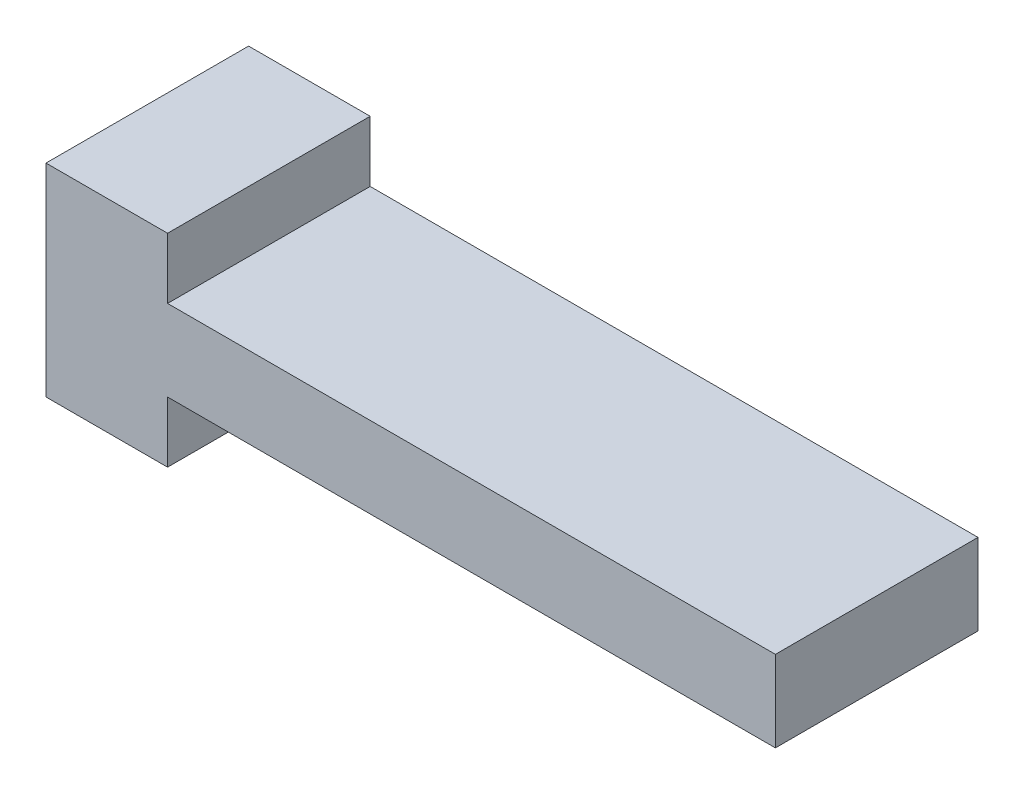
ISO-10303-21;
HEADER;
FILE_DESCRIPTION(('STEP AP214'),'2;1');
FILE_NAME('part.step','',(''),(''),'','','');
FILE_SCHEMA(('AUTOMOTIVE_DESIGN { 1 0 10303 214 1 1 1 1 }'));
ENDSEC;
DATA;
#1=APPLICATION_CONTEXT('core data for automotive mechanical design processes');
#2=APPLICATION_PROTOCOL_DEFINITION('international standard','automotive_design',2000,#1);
#3=PRODUCT_CONTEXT('',#1,'mechanical');
#4=PRODUCT('Part','Part','',(#3));
#5=PRODUCT_RELATED_PRODUCT_CATEGORY('part','',(#4));
#6=PRODUCT_DEFINITION_FORMATION('','',#4);
#7=PRODUCT_DEFINITION_CONTEXT('part definition',#1,'design');
#8=PRODUCT_DEFINITION('design','',#6,#7);
#9=PRODUCT_DEFINITION_SHAPE('','',#8);
#10=(LENGTH_UNIT() NAMED_UNIT(*) SI_UNIT(.MILLI.,.METRE.));
#11=(NAMED_UNIT(*) PLANE_ANGLE_UNIT() SI_UNIT($,.RADIAN.));
#12=(NAMED_UNIT(*) SI_UNIT($,.STERADIAN.) SOLID_ANGLE_UNIT());
#13=UNCERTAINTY_MEASURE_WITH_UNIT(LENGTH_MEASURE(1.E-05),#10,'distance_accuracy_value','');
#14=(GEOMETRIC_REPRESENTATION_CONTEXT(3) GLOBAL_UNCERTAINTY_ASSIGNED_CONTEXT((#13)) GLOBAL_UNIT_ASSIGNED_CONTEXT((#10,
#11,#12)) REPRESENTATION_CONTEXT('',''));
#15=CARTESIAN_POINT('',(0.,0.,0.));
#16=DIRECTION('',(0.,0.,1.));
#17=DIRECTION('',(1.,0.,0.));
#18=AXIS2_PLACEMENT_3D('',#15,#16,#17);
#19=CARTESIAN_POINT('',(30.,25.,50.));
#20=DIRECTION('',(0.,-1.,0.));
#21=DIRECTION('',(1.,0.,0.));
#22=AXIS2_PLACEMENT_3D('',#19,#20,#21);
#23=PLANE('',#22);
#24=DIRECTION('',(-1.,0.,0.));
#25=VECTOR('',#24,1.);
#26=CARTESIAN_POINT('',(30.,25.,0.));
#27=LINE('',#26,#25);
#28=CARTESIAN_POINT('',(30.,25.,0.));
#29=VERTEX_POINT('',#28);
#30=CARTESIAN_POINT('',(0.,25.,0.));
#31=VERTEX_POINT('',#30);
#32=EDGE_CURVE('E135',#29,#31,#27,.T.);
#33=ORIENTED_EDGE('',*,*,#32,.T.);
#34=DIRECTION('',(0.,0.,-1.));
#35=VECTOR('',#34,1.);
#36=CARTESIAN_POINT('',(0.,25.,50.));
#37=LINE('',#36,#35);
#38=CARTESIAN_POINT('',(0.,25.,50.));
#39=VERTEX_POINT('',#38);
#40=EDGE_CURVE('E11',#39,#31,#37,.T.);
#41=ORIENTED_EDGE('',*,*,#40,.F.);
#42=DIRECTION('',(-1.,0.,0.));
#43=VECTOR('',#42,1.);
#44=CARTESIAN_POINT('',(30.,25.,50.));
#45=LINE('',#44,#43);
#46=CARTESIAN_POINT('',(30.,25.,50.));
#47=VERTEX_POINT('',#46);
#48=EDGE_CURVE('E149',#47,#39,#45,.T.);
#49=ORIENTED_EDGE('',*,*,#48,.F.);
#50=DIRECTION('',(0.,0.,-1.));
#51=VECTOR('',#50,1.);
#52=CARTESIAN_POINT('',(30.,25.,50.));
#53=LINE('',#52,#51);
#54=EDGE_CURVE('E131',#47,#29,#53,.T.);
#55=ORIENTED_EDGE('',*,*,#54,.T.);
#56=EDGE_LOOP('',(#33,#41,#49,#55));
#57=FACE_BOUND('',#56,.T.);
#58=ADVANCED_FACE('F39',(#57),#23,.F.);
#59=CARTESIAN_POINT('',(0.,25.,50.));
#60=DIRECTION('',(1.,0.,0.));
#61=DIRECTION('',(0.,1.,0.));
#62=AXIS2_PLACEMENT_3D('',#59,#60,#61);
#63=PLANE('',#62);
#64=DIRECTION('',(0.,-1.,0.));
#65=VECTOR('',#64,1.);
#66=CARTESIAN_POINT('',(0.,25.,0.));
#67=LINE('',#66,#65);
#68=CARTESIAN_POINT('',(0.,-25.,0.));
#69=VERTEX_POINT('',#68);
#70=EDGE_CURVE('E138',#31,#69,#67,.T.);
#71=ORIENTED_EDGE('',*,*,#70,.T.);
#72=DIRECTION('',(0.,0.,-1.));
#73=VECTOR('',#72,1.);
#74=CARTESIAN_POINT('',(0.,-25.,50.));
#75=LINE('',#74,#73);
#76=CARTESIAN_POINT('',(0.,-25.,50.));
#77=VERTEX_POINT('',#76);
#78=EDGE_CURVE('E47',#77,#69,#75,.T.);
#79=ORIENTED_EDGE('',*,*,#78,.F.);
#80=DIRECTION('',(0.,-1.,0.));
#81=VECTOR('',#80,1.);
#82=CARTESIAN_POINT('',(0.,25.,50.));
#83=LINE('',#82,#81);
#84=EDGE_CURVE('E98',#39,#77,#83,.T.);
#85=ORIENTED_EDGE('',*,*,#84,.F.);
#86=ORIENTED_EDGE('',*,*,#40,.T.);
#87=EDGE_LOOP('',(#71,#79,#85,#86));
#88=FACE_BOUND('',#87,.T.);
#89=ADVANCED_FACE('F184',(#88),#63,.F.);
#90=CARTESIAN_POINT('',(0.,-25.,50.));
#91=DIRECTION('',(0.,1.,0.));
#92=DIRECTION('',(-1.,0.,0.));
#93=AXIS2_PLACEMENT_3D('',#90,#91,#92);
#94=PLANE('',#93);
#95=DIRECTION('',(1.,0.,0.));
#96=VECTOR('',#95,1.);
#97=CARTESIAN_POINT('',(0.,-25.,0.));
#98=LINE('',#97,#96);
#99=CARTESIAN_POINT('',(30.,-25.,0.));
#100=VERTEX_POINT('',#99);
#101=EDGE_CURVE('E140',#69,#100,#98,.T.);
#102=ORIENTED_EDGE('',*,*,#101,.T.);
#103=DIRECTION('',(0.,0.,-1.));
#104=VECTOR('',#103,1.);
#105=CARTESIAN_POINT('',(30.,-25.,50.));
#106=LINE('',#105,#104);
#107=CARTESIAN_POINT('',(30.,-25.,50.));
#108=VERTEX_POINT('',#107);
#109=EDGE_CURVE('E156',#108,#100,#106,.T.);
#110=ORIENTED_EDGE('',*,*,#109,.F.);
#111=DIRECTION('',(1.,0.,0.));
#112=VECTOR('',#111,1.);
#113=CARTESIAN_POINT('',(0.,-25.,50.));
#114=LINE('',#113,#112);
#115=EDGE_CURVE('E164',#77,#108,#114,.T.);
#116=ORIENTED_EDGE('',*,*,#115,.F.);
#117=ORIENTED_EDGE('',*,*,#78,.T.);
#118=EDGE_LOOP('',(#102,#110,#116,#117));
#119=FACE_BOUND('',#118,.T.);
#120=ADVANCED_FACE('F162',(#119),#94,.F.);
#121=CARTESIAN_POINT('',(30.,-25.,50.));
#122=DIRECTION('',(-1.,0.,0.));
#123=DIRECTION('',(0.,-1.,0.));
#124=AXIS2_PLACEMENT_3D('',#121,#122,#123);
#125=PLANE('',#124);
#126=DIRECTION('',(0.,1.,0.));
#127=VECTOR('',#126,1.);
#128=CARTESIAN_POINT('',(30.,-25.,0.));
#129=LINE('',#128,#127);
#130=CARTESIAN_POINT('',(30.,-9.99999999999998,0.));
#131=VERTEX_POINT('',#130);
#132=EDGE_CURVE('E142',#100,#131,#129,.T.);
#133=ORIENTED_EDGE('',*,*,#132,.T.);
#134=DIRECTION('',(0.,0.,-1.));
#135=VECTOR('',#134,1.);
#136=CARTESIAN_POINT('',(30.,-9.99999999999998,50.));
#137=LINE('',#136,#135);
#138=CARTESIAN_POINT('',(30.,-9.99999999999998,50.));
#139=VERTEX_POINT('',#138);
#140=EDGE_CURVE('E153',#139,#131,#137,.T.);
#141=ORIENTED_EDGE('',*,*,#140,.F.);
#142=DIRECTION('',(0.,1.,0.));
#143=VECTOR('',#142,1.);
#144=CARTESIAN_POINT('',(30.,-25.,50.));
#145=LINE('',#144,#143);
#146=EDGE_CURVE('E176',#108,#139,#145,.T.);
#147=ORIENTED_EDGE('',*,*,#146,.F.);
#148=ORIENTED_EDGE('',*,*,#109,.T.);
#149=EDGE_LOOP('',(#133,#141,#147,#148));
#150=FACE_BOUND('',#149,.T.);
#151=ADVANCED_FACE('F172',(#150),#125,.F.);
#152=CARTESIAN_POINT('',(30.,-9.99999999999998,50.));
#153=DIRECTION('',(0.,1.,0.));
#154=DIRECTION('',(-1.,0.,0.));
#155=AXIS2_PLACEMENT_3D('',#152,#153,#154);
#156=PLANE('',#155);
#157=DIRECTION('',(1.,0.,0.));
#158=VECTOR('',#157,1.);
#159=CARTESIAN_POINT('',(30.,-9.99999999999998,0.));
#160=LINE('',#159,#158);
#161=CARTESIAN_POINT('',(180.,-10.,0.));
#162=VERTEX_POINT('',#161);
#163=EDGE_CURVE('E144',#131,#162,#160,.T.);
#164=ORIENTED_EDGE('',*,*,#163,.T.);
#165=DIRECTION('',(0.,0.,-1.));
#166=VECTOR('',#165,1.);
#167=CARTESIAN_POINT('',(180.,-10.,50.));
#168=LINE('',#167,#166);
#169=CARTESIAN_POINT('',(180.,-10.,50.));
#170=VERTEX_POINT('',#169);
#171=EDGE_CURVE('E126',#170,#162,#168,.T.);
#172=ORIENTED_EDGE('',*,*,#171,.F.);
#173=DIRECTION('',(1.,0.,0.));
#174=VECTOR('',#173,1.);
#175=CARTESIAN_POINT('',(30.,-9.99999999999998,50.));
#176=LINE('',#175,#174);
#177=EDGE_CURVE('E117',#139,#170,#176,.T.);
#178=ORIENTED_EDGE('',*,*,#177,.F.);
#179=ORIENTED_EDGE('',*,*,#140,.T.);
#180=EDGE_LOOP('',(#164,#172,#178,#179));
#181=FACE_BOUND('',#180,.T.);
#182=ADVANCED_FACE('F175',(#181),#156,.F.);
#183=CARTESIAN_POINT('',(180.,-10.,50.));
#184=DIRECTION('',(-1.,0.,0.));
#185=DIRECTION('',(0.,0.,1.));
#186=AXIS2_PLACEMENT_3D('',#183,#184,#185);
#187=PLANE('',#186);
#188=DIRECTION('',(0.,1.,0.));
#189=VECTOR('',#188,1.);
#190=CARTESIAN_POINT('',(180.,-10.,0.));
#191=LINE('',#190,#189);
#192=CARTESIAN_POINT('',(180.,10.,0.));
#193=VERTEX_POINT('',#192);
#194=EDGE_CURVE('E125',#162,#193,#191,.T.);
#195=ORIENTED_EDGE('',*,*,#194,.T.);
#196=DIRECTION('',(0.,0.,-1.));
#197=VECTOR('',#196,1.);
#198=CARTESIAN_POINT('',(180.,10.,50.));
#199=LINE('',#198,#197);
#200=CARTESIAN_POINT('',(180.,10.,50.));
#201=VERTEX_POINT('',#200);
#202=EDGE_CURVE('E122',#201,#193,#199,.T.);
#203=ORIENTED_EDGE('',*,*,#202,.F.);
#204=DIRECTION('',(0.,1.,0.));
#205=VECTOR('',#204,1.);
#206=CARTESIAN_POINT('',(180.,-10.,50.));
#207=LINE('',#206,#205);
#208=EDGE_CURVE('E111',#170,#201,#207,.T.);
#209=ORIENTED_EDGE('',*,*,#208,.F.);
#210=ORIENTED_EDGE('',*,*,#171,.T.);
#211=EDGE_LOOP('',(#195,#203,#209,#210));
#212=FACE_BOUND('',#211,.T.);
#213=ADVANCED_FACE('F123',(#212),#187,.F.);
#214=CARTESIAN_POINT('',(180.,10.,50.));
#215=DIRECTION('',(0.,-1.,0.));
#216=DIRECTION('',(1.,0.,0.));
#217=AXIS2_PLACEMENT_3D('',#214,#215,#216);
#218=PLANE('',#217);
#219=DIRECTION('',(-1.,0.,0.));
#220=VECTOR('',#219,1.);
#221=CARTESIAN_POINT('',(180.,10.,0.));
#222=LINE('',#221,#220);
#223=CARTESIAN_POINT('',(30.,9.99999999999998,0.));
#224=VERTEX_POINT('',#223);
#225=EDGE_CURVE('E84',#193,#224,#222,.T.);
#226=ORIENTED_EDGE('',*,*,#225,.T.);
#227=DIRECTION('',(0.,0.,-1.));
#228=VECTOR('',#227,1.);
#229=CARTESIAN_POINT('',(30.,9.99999999999998,50.));
#230=LINE('',#229,#228);
#231=CARTESIAN_POINT('',(30.,9.99999999999998,50.));
#232=VERTEX_POINT('',#231);
#233=EDGE_CURVE('E127',#232,#224,#230,.T.);
#234=ORIENTED_EDGE('',*,*,#233,.F.);
#235=DIRECTION('',(-1.,0.,0.));
#236=VECTOR('',#235,1.);
#237=CARTESIAN_POINT('',(180.,10.,50.));
#238=LINE('',#237,#236);
#239=EDGE_CURVE('E115',#201,#232,#238,.T.);
#240=ORIENTED_EDGE('',*,*,#239,.F.);
#241=ORIENTED_EDGE('',*,*,#202,.T.);
#242=EDGE_LOOP('',(#226,#234,#240,#241));
#243=FACE_BOUND('',#242,.T.);
#244=ADVANCED_FACE('F129',(#243),#218,.F.);
#245=CARTESIAN_POINT('',(30.,9.99999999999998,50.));
#246=DIRECTION('',(-1.,0.,0.));
#247=DIRECTION('',(0.,0.,1.));
#248=AXIS2_PLACEMENT_3D('',#245,#246,#247);
#249=PLANE('',#248);
#250=DIRECTION('',(0.,1.,0.));
#251=VECTOR('',#250,1.);
#252=CARTESIAN_POINT('',(30.,9.99999999999998,0.));
#253=LINE('',#252,#251);
#254=EDGE_CURVE('E90',#224,#29,#253,.T.);
#255=ORIENTED_EDGE('',*,*,#254,.T.);
#256=ORIENTED_EDGE('',*,*,#54,.F.);
#257=DIRECTION('',(0.,1.,0.));
#258=VECTOR('',#257,1.);
#259=CARTESIAN_POINT('',(30.,9.99999999999998,50.));
#260=LINE('',#259,#258);
#261=EDGE_CURVE('E55',#232,#47,#260,.T.);
#262=ORIENTED_EDGE('',*,*,#261,.F.);
#263=ORIENTED_EDGE('',*,*,#233,.T.);
#264=EDGE_LOOP('',(#255,#256,#262,#263));
#265=FACE_BOUND('',#264,.T.);
#266=ADVANCED_FACE('F200',(#265),#249,.F.);
#267=CARTESIAN_POINT('',(0.,0.,50.));
#268=DIRECTION('',(0.,0.,1.));
#269=DIRECTION('',(1.,0.,0.));
#270=AXIS2_PLACEMENT_3D('',#267,#268,#269);
#271=PLANE('',#270);
#272=ORIENTED_EDGE('',*,*,#48,.T.);
#273=ORIENTED_EDGE('',*,*,#84,.T.);
#274=ORIENTED_EDGE('',*,*,#115,.T.);
#275=ORIENTED_EDGE('',*,*,#146,.T.);
#276=ORIENTED_EDGE('',*,*,#177,.T.);
#277=ORIENTED_EDGE('',*,*,#208,.T.);
#278=ORIENTED_EDGE('',*,*,#239,.T.);
#279=ORIENTED_EDGE('',*,*,#261,.T.);
#280=EDGE_LOOP('',(#272,#273,#274,#275,#276,#277,#278,#279));
#281=FACE_BOUND('',#280,.T.);
#282=ADVANCED_FACE('F113',(#281),#271,.T.);
#283=CARTESIAN_POINT('',(0.,0.,0.));
#284=DIRECTION('',(0.,0.,1.));
#285=DIRECTION('',(1.,0.,0.));
#286=AXIS2_PLACEMENT_3D('',#283,#284,#285);
#287=PLANE('',#286);
#288=ORIENTED_EDGE('',*,*,#32,.F.);
#289=ORIENTED_EDGE('',*,*,#254,.F.);
#290=ORIENTED_EDGE('',*,*,#225,.F.);
#291=ORIENTED_EDGE('',*,*,#194,.F.);
#292=ORIENTED_EDGE('',*,*,#163,.F.);
#293=ORIENTED_EDGE('',*,*,#132,.F.);
#294=ORIENTED_EDGE('',*,*,#101,.F.);
#295=ORIENTED_EDGE('',*,*,#70,.F.);
#296=EDGE_LOOP('',(#288,#289,#290,#291,#292,#293,#294,#295));
#297=FACE_BOUND('',#296,.T.);
#298=ADVANCED_FACE('F168',(#297),#287,.F.);
#299=CLOSED_SHELL('',(#58,#89,#120,#151,#182,#213,#244,#266,#282,#298));
#300=MANIFOLD_SOLID_BREP('B2',#299);
#301=ADVANCED_BREP_SHAPE_REPRESENTATION('',(#18,#300),#14);
#302=SHAPE_DEFINITION_REPRESENTATION(#9,#301);
ENDSEC;
END-ISO-10303-21;
